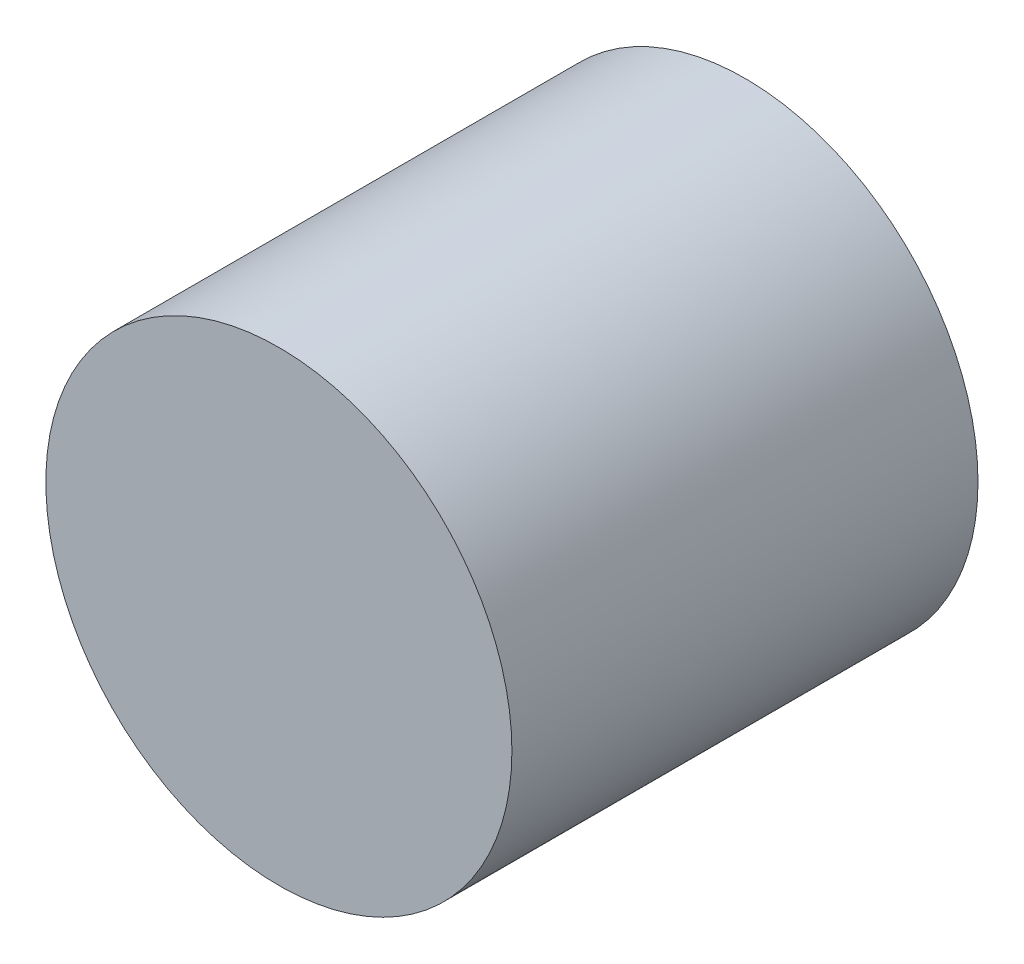
ISO-10303-21;
HEADER;
FILE_DESCRIPTION(('STEP AP214'),'2;1');
FILE_NAME('part.step','',(''),(''),'','','');
FILE_SCHEMA(('AUTOMOTIVE_DESIGN { 1 0 10303 214 1 1 1 1 }'));
ENDSEC;
DATA;
#1=APPLICATION_CONTEXT('core data for automotive mechanical design processes');
#2=APPLICATION_PROTOCOL_DEFINITION('international standard','automotive_design',2000,#1);
#3=PRODUCT_CONTEXT('',#1,'mechanical');
#4=PRODUCT('Part','Part','',(#3));
#5=PRODUCT_RELATED_PRODUCT_CATEGORY('part','',(#4));
#6=PRODUCT_DEFINITION_FORMATION('','',#4);
#7=PRODUCT_DEFINITION_CONTEXT('part definition',#1,'design');
#8=PRODUCT_DEFINITION('design','',#6,#7);
#9=PRODUCT_DEFINITION_SHAPE('','',#8);
#10=(LENGTH_UNIT() NAMED_UNIT(*) SI_UNIT(.MILLI.,.METRE.));
#11=(NAMED_UNIT(*) PLANE_ANGLE_UNIT() SI_UNIT($,.RADIAN.));
#12=(NAMED_UNIT(*) SI_UNIT($,.STERADIAN.) SOLID_ANGLE_UNIT());
#13=UNCERTAINTY_MEASURE_WITH_UNIT(LENGTH_MEASURE(1.E-05),#10,'distance_accuracy_value','');
#14=(GEOMETRIC_REPRESENTATION_CONTEXT(3) GLOBAL_UNCERTAINTY_ASSIGNED_CONTEXT((#13)) GLOBAL_UNIT_ASSIGNED_CONTEXT((#10,
#11,#12)) REPRESENTATION_CONTEXT('',''));
#15=CARTESIAN_POINT('',(0.,0.,0.));
#16=DIRECTION('',(0.,0.,1.));
#17=DIRECTION('',(1.,0.,0.));
#18=AXIS2_PLACEMENT_3D('',#15,#16,#17);
#19=CARTESIAN_POINT('',(0.,425.078577336642,110.));
#20=DIRECTION('',(0.,0.,-1.));
#21=DIRECTION('',(-1.,0.,0.));
#22=AXIS2_PLACEMENT_3D('',#19,#20,#21);
#23=CYLINDRICAL_SURFACE('',#22,55.);
#24=CARTESIAN_POINT('',(0.,425.078577336642,110.));
#25=DIRECTION('',(0.,0.,1.));
#26=DIRECTION('',(1.,0.,0.));
#27=AXIS2_PLACEMENT_3D('',#24,#25,#26);
#28=CIRCLE('',#27,55.);
#29=CARTESIAN_POINT('',(55.,425.078577336642,110.));
#30=VERTEX_POINT('',#29);
#31=EDGE_CURVE('E10',#30,#30,#28,.T.);
#32=ORIENTED_EDGE('',*,*,#31,.F.);
#33=EDGE_LOOP('',(#32));
#34=FACE_BOUND('',#33,.T.);
#35=CARTESIAN_POINT('',(0.,425.078577336642,0.));
#36=DIRECTION('',(0.,0.,1.));
#37=DIRECTION('',(1.,0.,0.));
#38=AXIS2_PLACEMENT_3D('',#35,#36,#37);
#39=CIRCLE('',#38,55.);
#40=CARTESIAN_POINT('',(55.,425.078577336642,0.));
#41=VERTEX_POINT('',#40);
#42=EDGE_CURVE('E34',#41,#41,#39,.T.);
#43=ORIENTED_EDGE('',*,*,#42,.T.);
#44=EDGE_LOOP('',(#43));
#45=FACE_BOUND('',#44,.T.);
#46=ADVANCED_FACE('F31',(#34,#45),#23,.T.);
#47=CARTESIAN_POINT('',(0.,425.078577336642,110.));
#48=DIRECTION('',(0.,0.,1.));
#49=DIRECTION('',(1.,0.,0.));
#50=AXIS2_PLACEMENT_3D('',#47,#48,#49);
#51=PLANE('',#50);
#52=ORIENTED_EDGE('',*,*,#31,.T.);
#53=EDGE_LOOP('',(#52));
#54=FACE_BOUND('',#53,.T.);
#55=ADVANCED_FACE('F46',(#54),#51,.T.);
#56=CARTESIAN_POINT('',(0.,425.078577336642,0.));
#57=DIRECTION('',(0.,0.,1.));
#58=DIRECTION('',(1.,0.,0.));
#59=AXIS2_PLACEMENT_3D('',#56,#57,#58);
#60=PLANE('',#59);
#61=ORIENTED_EDGE('',*,*,#42,.F.);
#62=EDGE_LOOP('',(#61));
#63=FACE_BOUND('',#62,.T.);
#64=ADVANCED_FACE('F44',(#63),#60,.F.);
#65=CLOSED_SHELL('',(#46,#55,#64));
#66=MANIFOLD_SOLID_BREP('B2',#65);
#67=ADVANCED_BREP_SHAPE_REPRESENTATION('',(#18,#66),#14);
#68=SHAPE_DEFINITION_REPRESENTATION(#9,#67);
ENDSEC;
END-ISO-10303-21;
